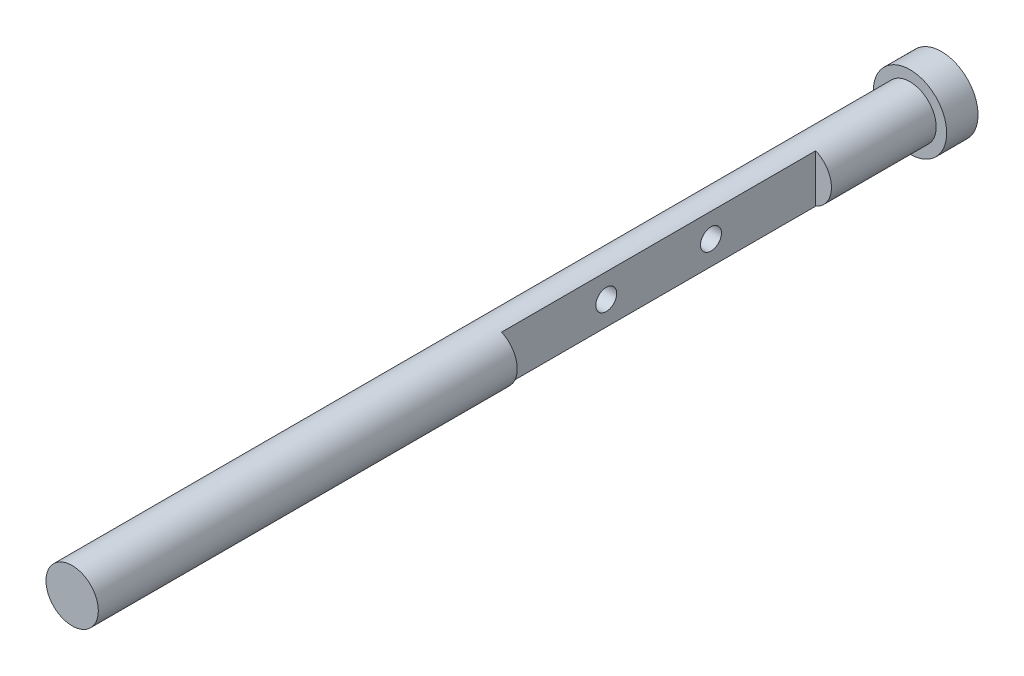
ISO-10303-21;
HEADER;
FILE_DESCRIPTION(('STEP AP214'),'2;1');
FILE_NAME('part.step','',(''),(''),'','','');
FILE_SCHEMA(('AUTOMOTIVE_DESIGN { 1 0 10303 214 1 1 1 1 }'));
ENDSEC;
DATA;
#1=APPLICATION_CONTEXT('core data for automotive mechanical design processes');
#2=APPLICATION_PROTOCOL_DEFINITION('international standard','automotive_design',2000,#1);
#3=PRODUCT_CONTEXT('',#1,'mechanical');
#4=PRODUCT('Part','Part','',(#3));
#5=PRODUCT_RELATED_PRODUCT_CATEGORY('part','',(#4));
#6=PRODUCT_DEFINITION_FORMATION('','',#4);
#7=PRODUCT_DEFINITION_CONTEXT('part definition',#1,'design');
#8=PRODUCT_DEFINITION('design','',#6,#7);
#9=PRODUCT_DEFINITION_SHAPE('','',#8);
#10=(LENGTH_UNIT() NAMED_UNIT(*) SI_UNIT(.MILLI.,.METRE.));
#11=(NAMED_UNIT(*) PLANE_ANGLE_UNIT() SI_UNIT($,.RADIAN.));
#12=(NAMED_UNIT(*) SI_UNIT($,.STERADIAN.) SOLID_ANGLE_UNIT());
#13=UNCERTAINTY_MEASURE_WITH_UNIT(LENGTH_MEASURE(1.E-05),#10,'distance_accuracy_value','');
#14=(GEOMETRIC_REPRESENTATION_CONTEXT(3) GLOBAL_UNCERTAINTY_ASSIGNED_CONTEXT((#13)) GLOBAL_UNIT_ASSIGNED_CONTEXT((#10,
#11,#12)) REPRESENTATION_CONTEXT('',''));
#15=CARTESIAN_POINT('',(0.,0.,0.));
#16=DIRECTION('',(0.,0.,1.));
#17=DIRECTION('',(1.,0.,0.));
#18=AXIS2_PLACEMENT_3D('',#15,#16,#17);
#19=CARTESIAN_POINT('',(0.,0.,80.));
#20=DIRECTION('',(0.,0.,-1.));
#21=DIRECTION('',(-1.,0.,0.));
#22=AXIS2_PLACEMENT_3D('',#19,#20,#21);
#23=CYLINDRICAL_SURFACE('',#22,2.5);
#24=CARTESIAN_POINT('',(0.,0.,40.));
#25=DIRECTION('',(0.,0.,-1.));
#26=DIRECTION('',(-1.,0.,0.));
#27=AXIS2_PLACEMENT_3D('',#24,#25,#26);
#28=CIRCLE('',#27,2.5);
#29=CARTESIAN_POINT('',(1.,2.29128784747792,40.));
#30=VERTEX_POINT('',#29);
#31=CARTESIAN_POINT('',(1.,-2.29128784747792,40.));
#32=VERTEX_POINT('',#31);
#33=EDGE_CURVE('E63',#30,#32,#28,.T.);
#34=ORIENTED_EDGE('',*,*,#33,.F.);
#35=DIRECTION('',(0.,0.,-1.));
#36=VECTOR('',#35,1.);
#37=CARTESIAN_POINT('',(1.,2.29128784747792,80.));
#38=LINE('',#37,#36);
#39=CARTESIAN_POINT('',(1.,2.29128784747792,10.));
#40=VERTEX_POINT('',#39);
#41=EDGE_CURVE('E11',#30,#40,#38,.T.);
#42=ORIENTED_EDGE('',*,*,#41,.T.);
#43=CARTESIAN_POINT('',(0.,0.,9.99999999999999));
#44=DIRECTION('',(0.,0.,1.));
#45=DIRECTION('',(1.,0.,0.));
#46=AXIS2_PLACEMENT_3D('',#43,#44,#45);
#47=CIRCLE('',#46,2.5);
#48=CARTESIAN_POINT('',(1.,-2.29128784747792,10.));
#49=VERTEX_POINT('',#48);
#50=EDGE_CURVE('E40',#49,#40,#47,.T.);
#51=ORIENTED_EDGE('',*,*,#50,.F.);
#52=DIRECTION('',(0.,0.,-1.));
#53=VECTOR('',#52,1.);
#54=CARTESIAN_POINT('',(1.,-2.29128784747792,80.));
#55=LINE('',#54,#53);
#56=EDGE_CURVE('E56',#49,#32,#55,.F.);
#57=ORIENTED_EDGE('',*,*,#56,.T.);
#58=EDGE_LOOP('',(#34,#42,#51,#57));
#59=FACE_BOUND('',#58,.T.);
#60=CARTESIAN_POINT('',(0.,0.,80.));
#61=DIRECTION('',(0.,0.,1.));
#62=DIRECTION('',(1.,0.,0.));
#63=AXIS2_PLACEMENT_3D('',#60,#61,#62);
#64=CIRCLE('',#63,2.5);
#65=CARTESIAN_POINT('',(2.5,0.,80.));
#66=VERTEX_POINT('',#65);
#67=EDGE_CURVE('E64',#66,#66,#64,.T.);
#68=ORIENTED_EDGE('',*,*,#67,.F.);
#69=EDGE_LOOP('',(#68));
#70=FACE_BOUND('',#69,.T.);
#71=CARTESIAN_POINT('',(0.,0.,0.));
#72=DIRECTION('',(0.,0.,1.));
#73=DIRECTION('',(1.,0.,0.));
#74=AXIS2_PLACEMENT_3D('',#71,#72,#73);
#75=CIRCLE('',#74,2.5);
#76=CARTESIAN_POINT('',(2.5,0.,0.));
#77=VERTEX_POINT('',#76);
#78=EDGE_CURVE('E73',#77,#77,#75,.T.);
#79=ORIENTED_EDGE('',*,*,#78,.T.);
#80=EDGE_LOOP('',(#79));
#81=FACE_BOUND('',#80,.T.);
#82=ADVANCED_FACE('F33',(#59,#70,#81),#23,.T.);
#83=CARTESIAN_POINT('',(0.,0.,80.));
#84=DIRECTION('',(0.,0.,1.));
#85=DIRECTION('',(1.,0.,0.));
#86=AXIS2_PLACEMENT_3D('',#83,#84,#85);
#87=PLANE('',#86);
#88=ORIENTED_EDGE('',*,*,#67,.T.);
#89=EDGE_LOOP('',(#88));
#90=FACE_BOUND('',#89,.T.);
#91=ADVANCED_FACE('F123',(#90),#87,.T.);
#92=CARTESIAN_POINT('',(0.,0.,-3.));
#93=DIRECTION('',(0.,0.,1.));
#94=DIRECTION('',(1.,0.,0.));
#95=AXIS2_PLACEMENT_3D('',#92,#93,#94);
#96=CYLINDRICAL_SURFACE('',#95,3.5);
#97=CARTESIAN_POINT('',(0.,0.,-3.));
#98=DIRECTION('',(0.,0.,-1.));
#99=DIRECTION('',(-1.,0.,0.));
#100=AXIS2_PLACEMENT_3D('',#97,#98,#99);
#101=CIRCLE('',#100,3.5);
#102=CARTESIAN_POINT('',(-3.5,0.,-3.));
#103=VERTEX_POINT('',#102);
#104=EDGE_CURVE('E76',#103,#103,#101,.T.);
#105=ORIENTED_EDGE('',*,*,#104,.F.);
#106=EDGE_LOOP('',(#105));
#107=FACE_BOUND('',#106,.T.);
#108=CARTESIAN_POINT('',(0.,0.,0.));
#109=DIRECTION('',(0.,0.,-1.));
#110=DIRECTION('',(-1.,0.,0.));
#111=AXIS2_PLACEMENT_3D('',#108,#109,#110);
#112=CIRCLE('',#111,3.5);
#113=CARTESIAN_POINT('',(-3.5,0.,0.));
#114=VERTEX_POINT('',#113);
#115=EDGE_CURVE('E79',#114,#114,#112,.T.);
#116=ORIENTED_EDGE('',*,*,#115,.T.);
#117=EDGE_LOOP('',(#116));
#118=FACE_BOUND('',#117,.T.);
#119=ADVANCED_FACE('F127',(#107,#118),#96,.T.);
#120=CARTESIAN_POINT('',(0.,0.,-3.));
#121=DIRECTION('',(0.,0.,-1.));
#122=DIRECTION('',(-1.,0.,0.));
#123=AXIS2_PLACEMENT_3D('',#120,#121,#122);
#124=PLANE('',#123);
#125=ORIENTED_EDGE('',*,*,#104,.T.);
#126=EDGE_LOOP('',(#125));
#127=FACE_BOUND('',#126,.T.);
#128=ADVANCED_FACE('F132',(#127),#124,.T.);
#129=CARTESIAN_POINT('',(0.,0.,0.));
#130=DIRECTION('',(0.,0.,-1.));
#131=DIRECTION('',(-1.,0.,0.));
#132=AXIS2_PLACEMENT_3D('',#129,#130,#131);
#133=PLANE('',#132);
#134=ORIENTED_EDGE('',*,*,#78,.F.);
#135=EDGE_LOOP('',(#134));
#136=FACE_BOUND('',#135,.T.);
#137=ORIENTED_EDGE('',*,*,#115,.F.);
#138=EDGE_LOOP('',(#137));
#139=FACE_BOUND('',#138,.T.);
#140=ADVANCED_FACE('F136',(#136,#139),#133,.F.);
#141=CARTESIAN_POINT('',(4.,2.5,10.));
#142=DIRECTION('',(0.,0.,1.));
#143=DIRECTION('',(1.,0.,0.));
#144=AXIS2_PLACEMENT_3D('',#141,#142,#143);
#145=PLANE('',#144);
#146=ORIENTED_EDGE('',*,*,#50,.T.);
#147=DIRECTION('',(0.,1.,0.));
#148=VECTOR('',#147,1.);
#149=CARTESIAN_POINT('',(1.,2.5,10.));
#150=LINE('',#149,#148);
#151=EDGE_CURVE('E59',#49,#40,#150,.T.);
#152=ORIENTED_EDGE('',*,*,#151,.F.);
#153=EDGE_LOOP('',(#146,#152));
#154=FACE_BOUND('',#153,.T.);
#155=ADVANCED_FACE('F67',(#154),#145,.T.);
#156=CARTESIAN_POINT('',(4.,2.5,40.));
#157=DIRECTION('',(0.,0.,-1.));
#158=DIRECTION('',(-1.,0.,0.));
#159=AXIS2_PLACEMENT_3D('',#156,#157,#158);
#160=PLANE('',#159);
#161=ORIENTED_EDGE('',*,*,#33,.T.);
#162=DIRECTION('',(0.,-1.,0.));
#163=VECTOR('',#162,1.);
#164=CARTESIAN_POINT('',(1.,2.5,40.));
#165=LINE('',#164,#163);
#166=EDGE_CURVE('E47',#30,#32,#165,.T.);
#167=ORIENTED_EDGE('',*,*,#166,.F.);
#168=EDGE_LOOP('',(#161,#167));
#169=FACE_BOUND('',#168,.T.);
#170=ADVANCED_FACE('F109',(#169),#160,.T.);
#171=CARTESIAN_POINT('',(1.,0.,0.));
#172=DIRECTION('',(-1.,0.,0.));
#173=DIRECTION('',(0.,0.,1.));
#174=AXIS2_PLACEMENT_3D('',#171,#172,#173);
#175=PLANE('',#174);
#176=CARTESIAN_POINT('',(1.,0.,30.));
#177=DIRECTION('',(1.,0.,0.));
#178=DIRECTION('',(0.,0.,-1.));
#179=AXIS2_PLACEMENT_3D('',#176,#177,#178);
#180=CIRCLE('',#179,0.999999999999998);
#181=CARTESIAN_POINT('',(1.,0.,29.));
#182=VERTEX_POINT('',#181);
#183=EDGE_CURVE('E91',#182,#182,#180,.T.);
#184=ORIENTED_EDGE('',*,*,#183,.F.);
#185=EDGE_LOOP('',(#184));
#186=FACE_BOUND('',#185,.T.);
#187=CARTESIAN_POINT('',(1.,0.,20.));
#188=DIRECTION('',(1.,0.,0.));
#189=DIRECTION('',(0.,0.,-1.));
#190=AXIS2_PLACEMENT_3D('',#187,#188,#189);
#191=CIRCLE('',#190,1.);
#192=CARTESIAN_POINT('',(1.,0.,19.));
#193=VERTEX_POINT('',#192);
#194=EDGE_CURVE('E85',#193,#193,#191,.T.);
#195=ORIENTED_EDGE('',*,*,#194,.F.);
#196=EDGE_LOOP('',(#195));
#197=FACE_BOUND('',#196,.T.);
#198=ORIENTED_EDGE('',*,*,#166,.T.);
#199=ORIENTED_EDGE('',*,*,#56,.F.);
#200=ORIENTED_EDGE('',*,*,#151,.T.);
#201=ORIENTED_EDGE('',*,*,#41,.F.);
#202=EDGE_LOOP('',(#198,#199,#200,#201));
#203=FACE_BOUND('',#202,.T.);
#204=ADVANCED_FACE('F58',(#186,#197,#203),#175,.F.);
#205=CARTESIAN_POINT('',(-0.5,0.,20.));
#206=DIRECTION('',(1.,0.,0.));
#207=DIRECTION('',(0.,0.,-1.));
#208=AXIS2_PLACEMENT_3D('',#205,#206,#207);
#209=CYLINDRICAL_SURFACE('',#208,1.);
#210=CARTESIAN_POINT('',(-0.5,0.,20.));
#211=DIRECTION('',(1.,0.,0.));
#212=DIRECTION('',(0.,0.,-1.));
#213=AXIS2_PLACEMENT_3D('',#210,#211,#212);
#214=CIRCLE('',#213,1.);
#215=CARTESIAN_POINT('',(-0.5,0.,19.));
#216=VERTEX_POINT('',#215);
#217=EDGE_CURVE('E88',#216,#216,#214,.T.);
#218=ORIENTED_EDGE('',*,*,#217,.F.);
#219=EDGE_LOOP('',(#218));
#220=FACE_BOUND('',#219,.T.);
#221=ORIENTED_EDGE('',*,*,#194,.T.);
#222=EDGE_LOOP('',(#221));
#223=FACE_BOUND('',#222,.T.);
#224=ADVANCED_FACE('F108',(#220,#223),#209,.F.);
#225=CARTESIAN_POINT('',(-0.5,0.,20.));
#226=DIRECTION('',(1.,0.,0.));
#227=DIRECTION('',(0.,0.,-1.));
#228=AXIS2_PLACEMENT_3D('',#225,#226,#227);
#229=PLANE('',#228);
#230=ORIENTED_EDGE('',*,*,#217,.T.);
#231=EDGE_LOOP('',(#230));
#232=FACE_BOUND('',#231,.T.);
#233=ADVANCED_FACE('F102',(#232),#229,.T.);
#234=CARTESIAN_POINT('',(-0.5,0.,30.));
#235=DIRECTION('',(1.,0.,0.));
#236=DIRECTION('',(0.,0.,-1.));
#237=AXIS2_PLACEMENT_3D('',#234,#235,#236);
#238=CYLINDRICAL_SURFACE('',#237,0.999999999999998);
#239=CARTESIAN_POINT('',(-0.5,0.,30.));
#240=DIRECTION('',(1.,0.,0.));
#241=DIRECTION('',(0.,0.,-1.));
#242=AXIS2_PLACEMENT_3D('',#239,#240,#241);
#243=CIRCLE('',#242,0.999999999999998);
#244=CARTESIAN_POINT('',(-0.5,0.,29.));
#245=VERTEX_POINT('',#244);
#246=EDGE_CURVE('E68',#245,#245,#243,.T.);
#247=ORIENTED_EDGE('',*,*,#246,.F.);
#248=EDGE_LOOP('',(#247));
#249=FACE_BOUND('',#248,.T.);
#250=ORIENTED_EDGE('',*,*,#183,.T.);
#251=EDGE_LOOP('',(#250));
#252=FACE_BOUND('',#251,.T.);
#253=ADVANCED_FACE('F99',(#249,#252),#238,.F.);
#254=CARTESIAN_POINT('',(-0.5,0.,30.));
#255=DIRECTION('',(1.,0.,0.));
#256=DIRECTION('',(0.,0.,-1.));
#257=AXIS2_PLACEMENT_3D('',#254,#255,#256);
#258=PLANE('',#257);
#259=ORIENTED_EDGE('',*,*,#246,.T.);
#260=EDGE_LOOP('',(#259));
#261=FACE_BOUND('',#260,.T.);
#262=ADVANCED_FACE('F97',(#261),#258,.T.);
#263=CLOSED_SHELL('',(#82,#91,#119,#128,#140,#155,#170,#204,#224,#233,#253,#262));
#264=MANIFOLD_SOLID_BREP('B2',#263);
#265=ADVANCED_BREP_SHAPE_REPRESENTATION('',(#18,#264),#14);
#266=SHAPE_DEFINITION_REPRESENTATION(#9,#265);
ENDSEC;
END-ISO-10303-21;
